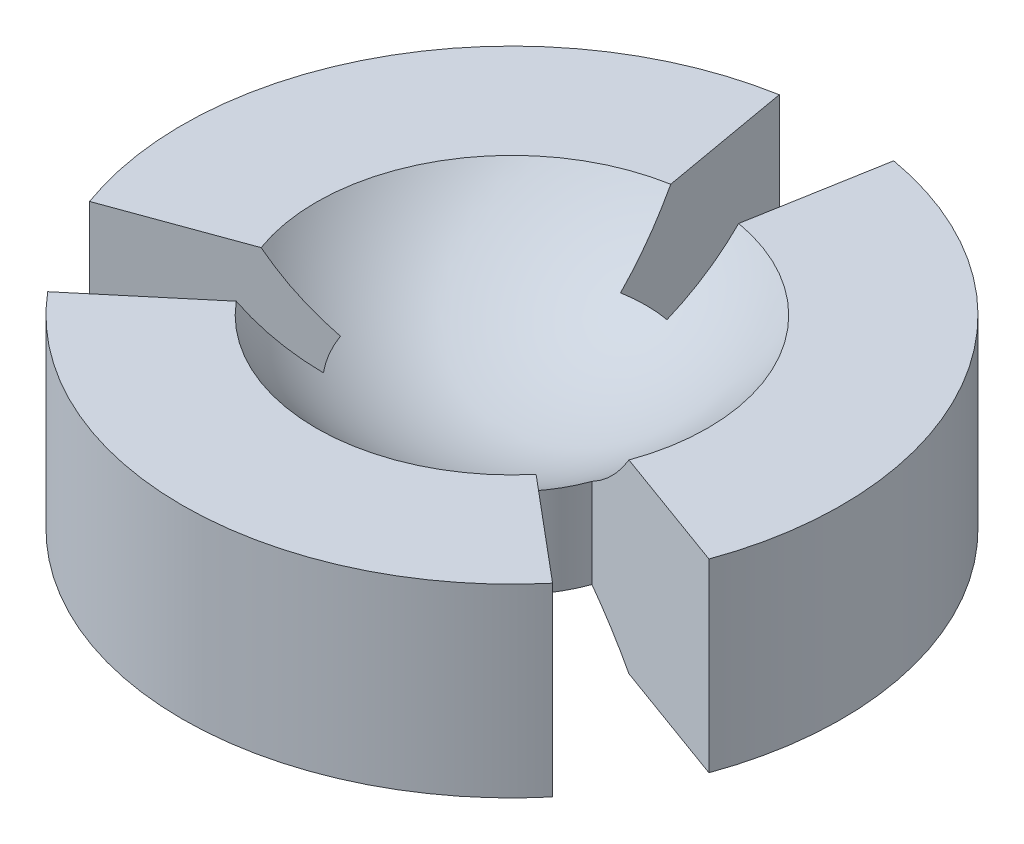
ISO-10303-21;
HEADER;
FILE_DESCRIPTION(('STEP AP214'),'2;1');
FILE_NAME('part.step','',(''),(''),'','','');
FILE_SCHEMA(('AUTOMOTIVE_DESIGN { 1 0 10303 214 1 1 1 1 }'));
ENDSEC;
DATA;
#1=APPLICATION_CONTEXT('core data for automotive mechanical design processes');
#2=APPLICATION_PROTOCOL_DEFINITION('international standard','automotive_design',2000,#1);
#3=PRODUCT_CONTEXT('',#1,'mechanical');
#4=PRODUCT('Part','Part','',(#3));
#5=PRODUCT_RELATED_PRODUCT_CATEGORY('part','',(#4));
#6=PRODUCT_DEFINITION_FORMATION('','',#4);
#7=PRODUCT_DEFINITION_CONTEXT('part definition',#1,'design');
#8=PRODUCT_DEFINITION('design','',#6,#7);
#9=PRODUCT_DEFINITION_SHAPE('','',#8);
#10=(LENGTH_UNIT() NAMED_UNIT(*) SI_UNIT(.MILLI.,.METRE.));
#11=(NAMED_UNIT(*) PLANE_ANGLE_UNIT() SI_UNIT($,.RADIAN.));
#12=(NAMED_UNIT(*) SI_UNIT($,.STERADIAN.) SOLID_ANGLE_UNIT());
#13=UNCERTAINTY_MEASURE_WITH_UNIT(LENGTH_MEASURE(1.E-05),#10,'distance_accuracy_value','');
#14=(GEOMETRIC_REPRESENTATION_CONTEXT(3) GLOBAL_UNCERTAINTY_ASSIGNED_CONTEXT((#13)) GLOBAL_UNIT_ASSIGNED_CONTEXT((#10,
#11,#12)) REPRESENTATION_CONTEXT('',''));
#15=CARTESIAN_POINT('',(0.,0.,0.));
#16=DIRECTION('',(0.,0.,1.));
#17=DIRECTION('',(1.,0.,0.));
#18=AXIS2_PLACEMENT_3D('',#15,#16,#17);
#19=CARTESIAN_POINT('',(0.,5.6,0.));
#20=DIRECTION('',(0.,1.,0.));
#21=DIRECTION('',(-1.,0.,0.));
#22=AXIS2_PLACEMENT_3D('',#19,#20,#21);
#23=PLANE('',#22);
#24=CARTESIAN_POINT('',(0.,5.6,0.));
#25=DIRECTION('',(0.,1.,0.));
#26=DIRECTION('',(-1.,0.,0.));
#27=AXIS2_PLACEMENT_3D('',#24,#25,#26);
#28=CIRCLE('',#27,4.92502957221124);
#29=CARTESIAN_POINT('',(-0.855222410170228,5.6,-4.85020730652802));
#30=VERTEX_POINT('',#29);
#31=CARTESIAN_POINT('',(-4.62801394615928,5.6,1.68445932017083));
#32=VERTEX_POINT('',#31);
#33=EDGE_CURVE('E306',#30,#32,#28,.T.);
#34=ORIENTED_EDGE('',*,*,#33,.F.);
#35=DIRECTION('',(0.173648177666931,0.,0.984807753012208));
#36=VECTOR('',#35,1.);
#37=CARTESIAN_POINT('',(-0.347296355333863,5.6,-1.96961550602442));
#38=LINE('',#37,#36);
#39=CARTESIAN_POINT('',(-0.507926054836366,5.6,-2.88059180050361));
#40=VERTEX_POINT('',#39);
#41=EDGE_CURVE('E324',#30,#40,#38,.T.);
#42=ORIENTED_EDGE('',*,*,#41,.T.);
#43=CARTESIAN_POINT('',(0.,5.6,0.));
#44=DIRECTION('',(0.,1.,0.));
#45=DIRECTION('',(-1.,0.,0.));
#46=AXIS2_PLACEMENT_3D('',#43,#44,#45);
#47=CIRCLE('',#46,2.92502957221124);
#48=CARTESIAN_POINT('',(-2.74862870458747,5.6,1.00041903351949));
#49=VERTEX_POINT('',#48);
#50=EDGE_CURVE('E207',#40,#49,#47,.T.);
#51=ORIENTED_EDGE('',*,*,#50,.T.);
#52=DIRECTION('',(-0.939692620785908,0.,0.342020143325671));
#53=VECTOR('',#52,1.);
#54=CARTESIAN_POINT('',(-1.87938524157182,5.6,0.68404028665132));
#55=LINE('',#54,#53);
#56=EDGE_CURVE('E278',#49,#32,#55,.T.);
#57=ORIENTED_EDGE('',*,*,#56,.T.);
#58=EDGE_LOOP('',(#34,#42,#51,#57));
#59=FACE_BOUND('',#58,.T.);
#60=ADVANCED_FACE('F45',(#59),#23,.F.);
#61=CARTESIAN_POINT('',(2.74862870458746,5.6,1.00041903351951));
#62=VERTEX_POINT('',#61);
#63=CARTESIAN_POINT('',(0.507926054836363,5.6,-2.88059180050361));
#64=VERTEX_POINT('',#63);
#65=EDGE_CURVE('E212',#62,#64,#47,.T.);
#66=ORIENTED_EDGE('',*,*,#65,.T.);
#67=DIRECTION('',(0.173648177666931,0.,-0.984807753012208));
#68=VECTOR('',#67,1.);
#69=CARTESIAN_POINT('',(0.34729635533386,5.6,-1.96961550602442));
#70=LINE('',#69,#68);
#71=CARTESIAN_POINT('',(0.855222410170224,5.6,-4.85020730652802));
#72=VERTEX_POINT('',#71);
#73=EDGE_CURVE('E322',#64,#72,#70,.T.);
#74=ORIENTED_EDGE('',*,*,#73,.T.);
#75=CARTESIAN_POINT('',(4.62801394615928,5.6,1.68445932017084));
#76=VERTEX_POINT('',#75);
#77=EDGE_CURVE('E307',#76,#72,#28,.T.);
#78=ORIENTED_EDGE('',*,*,#77,.F.);
#79=DIRECTION('',(-0.939692620785909,0.,-0.342020143325666));
#80=VECTOR('',#79,1.);
#81=CARTESIAN_POINT('',(1.87938524157181,5.6,0.684040286651345));
#82=LINE('',#81,#80);
#83=EDGE_CURVE('E259',#76,#62,#82,.T.);
#84=ORIENTED_EDGE('',*,*,#83,.T.);
#85=EDGE_LOOP('',(#66,#74,#78,#84));
#86=FACE_BOUND('',#85,.T.);
#87=ADVANCED_FACE('F320',(#86),#23,.F.);
#88=CARTESIAN_POINT('',(0.,8.36672218861415,0.));
#89=DIRECTION('',(0.,1.,0.));
#90=DIRECTION('',(-1.,0.,0.));
#91=AXIS2_PLACEMENT_3D('',#88,#89,#90);
#92=PLANE('',#91);
#93=DIRECTION('',(0.173648177666931,0.,0.984807753012208));
#94=VECTOR('',#93,1.);
#95=CARTESIAN_POINT('',(-0.347296355333863,8.36672218861415,-1.96961550602442));
#96=LINE('',#95,#94);
#97=CARTESIAN_POINT('',(-0.855222410170228,8.36672218861415,-4.85020730652802));
#98=VERTEX_POINT('',#97);
#99=CARTESIAN_POINT('',(-0.507926054836366,8.36672218861415,-2.88059180050361));
#100=VERTEX_POINT('',#99);
#101=EDGE_CURVE('E325',#98,#100,#96,.T.);
#102=ORIENTED_EDGE('',*,*,#101,.F.);
#103=CARTESIAN_POINT('',(0.,8.36672218861416,0.));
#104=DIRECTION('',(0.,1.,0.));
#105=DIRECTION('',(-1.,0.,0.));
#106=AXIS2_PLACEMENT_3D('',#103,#104,#105);
#107=CIRCLE('',#106,4.92502957221124);
#108=CARTESIAN_POINT('',(-4.62801394615928,8.36672218861416,1.68445932017083));
#109=VERTEX_POINT('',#108);
#110=EDGE_CURVE('E190',#98,#109,#107,.T.);
#111=ORIENTED_EDGE('',*,*,#110,.T.);
#112=DIRECTION('',(-0.939692620785908,0.,0.342020143325671));
#113=VECTOR('',#112,1.);
#114=CARTESIAN_POINT('',(-1.87938524157182,8.36672218861415,0.68404028665132));
#115=LINE('',#114,#113);
#116=CARTESIAN_POINT('',(-2.74862870458747,8.36672218861415,1.00041903351949));
#117=VERTEX_POINT('',#116);
#118=EDGE_CURVE('E173',#117,#109,#115,.T.);
#119=ORIENTED_EDGE('',*,*,#118,.F.);
#120=CARTESIAN_POINT('',(0.,8.36672218861415,0.));
#121=DIRECTION('',(0.,1.,0.));
#122=DIRECTION('',(-1.,0.,0.));
#123=AXIS2_PLACEMENT_3D('',#120,#121,#122);
#124=CIRCLE('',#123,2.92502957221124);
#125=EDGE_CURVE('E188',#100,#117,#124,.T.);
#126=ORIENTED_EDGE('',*,*,#125,.F.);
#127=EDGE_LOOP('',(#102,#111,#119,#126));
#128=FACE_BOUND('',#127,.T.);
#129=ADVANCED_FACE('F187',(#128),#92,.T.);
#130=DIRECTION('',(0.173648177666931,0.,-0.984807753012208));
#131=VECTOR('',#130,1.);
#132=CARTESIAN_POINT('',(0.34729635533386,8.36672218861415,-1.96961550602442));
#133=LINE('',#132,#131);
#134=CARTESIAN_POINT('',(0.507926054836362,8.36672218861415,-2.88059180050361));
#135=VERTEX_POINT('',#134);
#136=CARTESIAN_POINT('',(0.855222410170224,8.36672218861416,-4.85020730652802));
#137=VERTEX_POINT('',#136);
#138=EDGE_CURVE('E60',#135,#137,#133,.T.);
#139=ORIENTED_EDGE('',*,*,#138,.F.);
#140=CARTESIAN_POINT('',(2.74862870458746,8.36672218861415,1.00041903351951));
#141=VERTEX_POINT('',#140);
#142=EDGE_CURVE('E197',#141,#135,#124,.T.);
#143=ORIENTED_EDGE('',*,*,#142,.F.);
#144=DIRECTION('',(-0.939692620785909,0.,-0.342020143325666));
#145=VECTOR('',#144,1.);
#146=CARTESIAN_POINT('',(1.87938524157181,8.36672218861415,0.684040286651345));
#147=LINE('',#146,#145);
#148=CARTESIAN_POINT('',(4.62801394615928,8.36672218861415,1.68445932017084));
#149=VERTEX_POINT('',#148);
#150=EDGE_CURVE('E269',#149,#141,#147,.T.);
#151=ORIENTED_EDGE('',*,*,#150,.F.);
#152=EDGE_CURVE('E203',#149,#137,#107,.T.);
#153=ORIENTED_EDGE('',*,*,#152,.T.);
#154=EDGE_LOOP('',(#139,#143,#151,#153));
#155=FACE_BOUND('',#154,.T.);
#156=ADVANCED_FACE('F339',(#155),#92,.T.);
#157=CARTESIAN_POINT('',(0.,6.9,0.));
#158=DIRECTION('',(0.,1.,0.));
#159=DIRECTION('',(-1.,0.,0.));
#160=AXIS2_PLACEMENT_3D('',#157,#158,#159);
#161=CYLINDRICAL_SURFACE('',#160,4.92502957221124);
#162=ORIENTED_EDGE('',*,*,#110,.F.);
#163=DIRECTION('',(0.,1.,0.));
#164=VECTOR('',#163,1.);
#165=CARTESIAN_POINT('',(-0.855222410170228,6.9,-4.85020730652802));
#166=LINE('',#165,#164);
#167=EDGE_CURVE('E239',#98,#30,#166,.F.);
#168=ORIENTED_EDGE('',*,*,#167,.T.);
#169=ORIENTED_EDGE('',*,*,#33,.T.);
#170=DIRECTION('',(0.,1.,0.));
#171=VECTOR('',#170,1.);
#172=CARTESIAN_POINT('',(-4.62801394615928,6.9,1.68445932017083));
#173=LINE('',#172,#171);
#174=EDGE_CURVE('E221',#32,#109,#173,.T.);
#175=ORIENTED_EDGE('',*,*,#174,.T.);
#176=EDGE_LOOP('',(#162,#168,#169,#175));
#177=FACE_BOUND('',#176,.T.);
#178=ADVANCED_FACE('F349',(#177),#161,.T.);
#179=ORIENTED_EDGE('',*,*,#77,.T.);
#180=DIRECTION('',(0.,1.,0.));
#181=VECTOR('',#180,1.);
#182=CARTESIAN_POINT('',(0.855222410170224,6.9,-4.85020730652802));
#183=LINE('',#182,#181);
#184=EDGE_CURVE('E237',#72,#137,#183,.T.);
#185=ORIENTED_EDGE('',*,*,#184,.T.);
#186=ORIENTED_EDGE('',*,*,#152,.F.);
#187=DIRECTION('',(0.,1.,0.));
#188=VECTOR('',#187,1.);
#189=CARTESIAN_POINT('',(4.62801394615928,6.9,1.68445932017084));
#190=LINE('',#189,#188);
#191=EDGE_CURVE('E234',#149,#76,#190,.F.);
#192=ORIENTED_EDGE('',*,*,#191,.T.);
#193=EDGE_LOOP('',(#179,#185,#186,#192));
#194=FACE_BOUND('',#193,.T.);
#195=ADVANCED_FACE('F316',(#194),#161,.T.);
#196=CARTESIAN_POINT('',(-2.24070264975111,5.6,1.88017276698409));
#197=VERTEX_POINT('',#196);
#198=CARTESIAN_POINT('',(2.2407026497511,5.6,1.88017276698411));
#199=VERTEX_POINT('',#198);
#200=EDGE_CURVE('E213',#197,#199,#47,.T.);
#201=ORIENTED_EDGE('',*,*,#200,.T.);
#202=DIRECTION('',(0.766044443118979,0.,0.642787609686538));
#203=VECTOR('',#202,1.);
#204=CARTESIAN_POINT('',(1.53208888623795,5.6,1.28557521937309));
#205=LINE('',#204,#203);
#206=CARTESIAN_POINT('',(3.77279153598905,5.6,3.16574798635718));
#207=VERTEX_POINT('',#206);
#208=EDGE_CURVE('E262',#199,#207,#205,.T.);
#209=ORIENTED_EDGE('',*,*,#208,.T.);
#210=CARTESIAN_POINT('',(-3.77279153598906,5.6,3.16574798635718));
#211=VERTEX_POINT('',#210);
#212=EDGE_CURVE('E308',#211,#207,#28,.T.);
#213=ORIENTED_EDGE('',*,*,#212,.F.);
#214=DIRECTION('',(0.766044443118975,0.,-0.642787609686543));
#215=VECTOR('',#214,1.);
#216=CARTESIAN_POINT('',(-1.53208888623797,5.6,1.28557521937307));
#217=LINE('',#216,#215);
#218=EDGE_CURVE('E274',#211,#197,#217,.T.);
#219=ORIENTED_EDGE('',*,*,#218,.T.);
#220=EDGE_LOOP('',(#201,#209,#213,#219));
#221=FACE_BOUND('',#220,.T.);
#222=ADVANCED_FACE('F47',(#221),#23,.F.);
#223=CARTESIAN_POINT('',(0.,1.82210100084488,0.));
#224=DIRECTION('',(0.,1.,0.));
#225=DIRECTION('',(-1.,0.,0.));
#226=AXIS2_PLACEMENT_3D('',#223,#224,#225);
#227=SPHERICAL_SURFACE('',#226,4.77789899915513);
#228=CARTESIAN_POINT('',(0.,1.82210100084488,0.));
#229=DIRECTION('',(-0.984807753012208,0.,0.173648177666931));
#230=DIRECTION('',(0.173648177666931,0.,0.984807753012208));
#231=AXIS2_PLACEMENT_3D('',#228,#229,#230);
#232=CIRCLE('',#231,4.77789899915513);
#233=CARTESIAN_POINT('',(-0.347296355333863,6.16126207715071,-1.96961550602442));
#234=VERTEX_POINT('',#233);
#235=EDGE_CURVE('E298',#234,#40,#232,.T.);
#236=ORIENTED_EDGE('',*,*,#235,.F.);
#237=CARTESIAN_POINT('',(0.,6.16126207715071,0.));
#238=DIRECTION('',(0.,-1.,0.));
#239=DIRECTION('',(0.,0.,-1.));
#240=AXIS2_PLACEMENT_3D('',#237,#238,#239);
#241=CIRCLE('',#240,2.);
#242=CARTESIAN_POINT('',(0.34729635533386,6.16126207715071,-1.96961550602442));
#243=VERTEX_POINT('',#242);
#244=EDGE_CURVE('E304',#243,#234,#241,.F.);
#245=ORIENTED_EDGE('',*,*,#244,.F.);
#246=CARTESIAN_POINT('',(0.,1.82210100084488,0.));
#247=DIRECTION('',(0.984807753012208,0.,0.173648177666931));
#248=DIRECTION('',(0.173648177666931,0.,-0.984807753012208));
#249=AXIS2_PLACEMENT_3D('',#246,#247,#248);
#250=CIRCLE('',#249,4.77789899915513);
#251=EDGE_CURVE('E295',#64,#243,#250,.T.);
#252=ORIENTED_EDGE('',*,*,#251,.F.);
#253=ORIENTED_EDGE('',*,*,#65,.F.);
#254=CARTESIAN_POINT('',(0.,1.82210100084488,0.));
#255=DIRECTION('',(0.342020143325666,0.,-0.939692620785909));
#256=DIRECTION('',(-0.939692620785909,0.,-0.342020143325666));
#257=AXIS2_PLACEMENT_3D('',#254,#255,#256);
#258=CIRCLE('',#257,4.77789899915513);
#259=CARTESIAN_POINT('',(1.87938524157181,6.16126207715071,0.684040286651344));
#260=VERTEX_POINT('',#259);
#261=EDGE_CURVE('E290',#260,#62,#258,.T.);
#262=ORIENTED_EDGE('',*,*,#261,.F.);
#263=CARTESIAN_POINT('',(0.,6.16126207715071,0.));
#264=DIRECTION('',(0.,-1.,0.));
#265=DIRECTION('',(0.,0.,-1.));
#266=AXIS2_PLACEMENT_3D('',#263,#264,#265);
#267=CIRCLE('',#266,2.);
#268=CARTESIAN_POINT('',(1.53208888623795,6.16126207715071,1.28557521937309));
#269=VERTEX_POINT('',#268);
#270=EDGE_CURVE('E302',#269,#260,#267,.F.);
#271=ORIENTED_EDGE('',*,*,#270,.F.);
#272=CARTESIAN_POINT('',(0.,1.82210100084488,0.));
#273=DIRECTION('',(-0.642787609686538,0.,0.766044443118979));
#274=DIRECTION('',(0.766044443118979,0.,0.642787609686538));
#275=AXIS2_PLACEMENT_3D('',#272,#273,#274);
#276=CIRCLE('',#275,4.77789899915513);
#277=EDGE_CURVE('E258',#199,#269,#276,.T.);
#278=ORIENTED_EDGE('',*,*,#277,.F.);
#279=ORIENTED_EDGE('',*,*,#200,.F.);
#280=CARTESIAN_POINT('',(0.,1.82210100084488,0.));
#281=DIRECTION('',(0.642787609686543,0.,0.766044443118975));
#282=DIRECTION('',(0.766044443118975,0.,-0.642787609686543));
#283=AXIS2_PLACEMENT_3D('',#280,#281,#282);
#284=CIRCLE('',#283,4.77789899915513);
#285=CARTESIAN_POINT('',(-1.53208888623797,6.16126207715071,1.28557521937307));
#286=VERTEX_POINT('',#285);
#287=EDGE_CURVE('E285',#286,#197,#284,.T.);
#288=ORIENTED_EDGE('',*,*,#287,.F.);
#289=CARTESIAN_POINT('',(0.,6.16126207715071,0.));
#290=DIRECTION('',(0.,-1.,0.));
#291=DIRECTION('',(0.,0.,-1.));
#292=AXIS2_PLACEMENT_3D('',#289,#290,#291);
#293=CIRCLE('',#292,2.);
#294=CARTESIAN_POINT('',(-1.87938524157182,6.16126207715071,0.684040286651319));
#295=VERTEX_POINT('',#294);
#296=EDGE_CURVE('E300',#295,#286,#293,.F.);
#297=ORIENTED_EDGE('',*,*,#296,.F.);
#298=CARTESIAN_POINT('',(0.,1.82210100084488,0.));
#299=DIRECTION('',(-0.342020143325671,0.,-0.939692620785907));
#300=DIRECTION('',(-0.939692620785908,0.,0.342020143325671));
#301=AXIS2_PLACEMENT_3D('',#298,#299,#300);
#302=CIRCLE('',#301,4.77789899915513);
#303=EDGE_CURVE('E180',#49,#295,#302,.T.);
#304=ORIENTED_EDGE('',*,*,#303,.F.);
#305=ORIENTED_EDGE('',*,*,#50,.F.);
#306=EDGE_LOOP('',(#236,#245,#252,#253,#262,#271,#278,#279,#288,#297,#304,#305));
#307=FACE_BOUND('',#306,.T.);
#308=ADVANCED_FACE('F345',(#307),#227,.F.);
#309=CARTESIAN_POINT('',(0.,10.55,0.));
#310=DIRECTION('',(0.,1.,0.));
#311=DIRECTION('',(-1.,0.,0.));
#312=AXIS2_PLACEMENT_3D('',#309,#310,#311);
#313=SPHERICAL_SURFACE('',#312,3.65);
#314=CARTESIAN_POINT('',(0.,7.49672307184559,0.));
#315=DIRECTION('',(0.,1.,0.));
#316=DIRECTION('',(0.,0.,1.));
#317=AXIS2_PLACEMENT_3D('',#314,#315,#316);
#318=CIRCLE('',#317,2.);
#319=CARTESIAN_POINT('',(0.34729635533386,7.49672307184559,-1.96961550602442));
#320=VERTEX_POINT('',#319);
#321=CARTESIAN_POINT('',(-0.347296355333863,7.49672307184559,-1.96961550602442));
#322=VERTEX_POINT('',#321);
#323=EDGE_CURVE('E11',#320,#322,#318,.T.);
#324=ORIENTED_EDGE('',*,*,#323,.T.);
#325=CARTESIAN_POINT('',(0.,10.55,0.));
#326=DIRECTION('',(-0.984807753012208,0.,0.173648177666931));
#327=DIRECTION('',(0.173648177666931,0.,0.984807753012208));
#328=AXIS2_PLACEMENT_3D('',#325,#326,#327);
#329=CIRCLE('',#328,3.65);
#330=EDGE_CURVE('E196',#322,#100,#329,.F.);
#331=ORIENTED_EDGE('',*,*,#330,.T.);
#332=ORIENTED_EDGE('',*,*,#125,.T.);
#333=CARTESIAN_POINT('',(0.,10.55,0.));
#334=DIRECTION('',(-0.342020143325671,0.,-0.939692620785907));
#335=DIRECTION('',(-0.939692620785908,0.,0.342020143325671));
#336=AXIS2_PLACEMENT_3D('',#333,#334,#335);
#337=CIRCLE('',#336,3.65);
#338=CARTESIAN_POINT('',(-1.87938524157182,7.49672307184559,0.684040286651319));
#339=VERTEX_POINT('',#338);
#340=EDGE_CURVE('E170',#117,#339,#337,.F.);
#341=ORIENTED_EDGE('',*,*,#340,.T.);
#342=CARTESIAN_POINT('',(0.,7.49672307184559,0.));
#343=DIRECTION('',(0.,1.,0.));
#344=DIRECTION('',(0.,0.,1.));
#345=AXIS2_PLACEMENT_3D('',#342,#343,#344);
#346=CIRCLE('',#345,2.);
#347=CARTESIAN_POINT('',(-1.53208888623797,7.49672307184559,1.28557521937307));
#348=VERTEX_POINT('',#347);
#349=EDGE_CURVE('E242',#339,#348,#346,.T.);
#350=ORIENTED_EDGE('',*,*,#349,.T.);
#351=CARTESIAN_POINT('',(0.,10.55,0.));
#352=DIRECTION('',(0.642787609686543,0.,0.766044443118975));
#353=DIRECTION('',(0.766044443118975,0.,-0.642787609686543));
#354=AXIS2_PLACEMENT_3D('',#351,#352,#353);
#355=CIRCLE('',#354,3.65);
#356=CARTESIAN_POINT('',(-2.24070264975111,8.36672218861415,1.88017276698409));
#357=VERTEX_POINT('',#356);
#358=EDGE_CURVE('E283',#348,#357,#355,.F.);
#359=ORIENTED_EDGE('',*,*,#358,.T.);
#360=CARTESIAN_POINT('',(2.24070264975109,8.36672218861415,1.88017276698411));
#361=VERTEX_POINT('',#360);
#362=EDGE_CURVE('E200',#357,#361,#124,.T.);
#363=ORIENTED_EDGE('',*,*,#362,.T.);
#364=CARTESIAN_POINT('',(0.,10.55,0.));
#365=DIRECTION('',(-0.642787609686538,0.,0.766044443118979));
#366=DIRECTION('',(0.766044443118979,0.,0.642787609686538));
#367=AXIS2_PLACEMENT_3D('',#364,#365,#366);
#368=CIRCLE('',#367,3.65);
#369=CARTESIAN_POINT('',(1.53208888623795,7.49672307184559,1.28557521937309));
#370=VERTEX_POINT('',#369);
#371=EDGE_CURVE('E247',#361,#370,#368,.F.);
#372=ORIENTED_EDGE('',*,*,#371,.T.);
#373=CARTESIAN_POINT('',(0.,7.49672307184559,0.));
#374=DIRECTION('',(0.,1.,0.));
#375=DIRECTION('',(0.,0.,1.));
#376=AXIS2_PLACEMENT_3D('',#373,#374,#375);
#377=CIRCLE('',#376,2.);
#378=CARTESIAN_POINT('',(1.87938524157181,7.49672307184559,0.684040286651344));
#379=VERTEX_POINT('',#378);
#380=EDGE_CURVE('E53',#370,#379,#377,.T.);
#381=ORIENTED_EDGE('',*,*,#380,.T.);
#382=CARTESIAN_POINT('',(0.,10.55,0.));
#383=DIRECTION('',(0.342020143325666,0.,-0.939692620785909));
#384=DIRECTION('',(-0.939692620785909,0.,-0.342020143325666));
#385=AXIS2_PLACEMENT_3D('',#382,#383,#384);
#386=CIRCLE('',#385,3.65);
#387=EDGE_CURVE('E245',#379,#141,#386,.F.);
#388=ORIENTED_EDGE('',*,*,#387,.T.);
#389=ORIENTED_EDGE('',*,*,#142,.T.);
#390=CARTESIAN_POINT('',(0.,10.55,0.));
#391=DIRECTION('',(0.984807753012208,0.,0.173648177666931));
#392=DIRECTION('',(0.173648177666931,0.,-0.984807753012208));
#393=AXIS2_PLACEMENT_3D('',#390,#391,#392);
#394=CIRCLE('',#393,3.65);
#395=EDGE_CURVE('E292',#135,#320,#394,.F.);
#396=ORIENTED_EDGE('',*,*,#395,.T.);
#397=EDGE_LOOP('',(#324,#331,#332,#341,#350,#359,#363,#372,#381,#388,#389,#396));
#398=FACE_BOUND('',#397,.T.);
#399=ADVANCED_FACE('F195',(#398),#313,.F.);
#400=DIRECTION('',(0.766044443118979,0.,0.642787609686538));
#401=VECTOR('',#400,1.);
#402=CARTESIAN_POINT('',(1.53208888623795,8.36672218861415,1.28557521937309));
#403=LINE('',#402,#401);
#404=CARTESIAN_POINT('',(3.77279153598905,8.36672218861416,3.16574798635718));
#405=VERTEX_POINT('',#404);
#406=EDGE_CURVE('E68',#361,#405,#403,.T.);
#407=ORIENTED_EDGE('',*,*,#406,.F.);
#408=ORIENTED_EDGE('',*,*,#362,.F.);
#409=DIRECTION('',(0.766044443118975,0.,-0.642787609686543));
#410=VECTOR('',#409,1.);
#411=CARTESIAN_POINT('',(-1.53208888623797,8.36672218861415,1.28557521937307));
#412=LINE('',#411,#410);
#413=CARTESIAN_POINT('',(-3.77279153598906,8.36672218861415,3.16574798635718));
#414=VERTEX_POINT('',#413);
#415=EDGE_CURVE('E192',#414,#357,#412,.T.);
#416=ORIENTED_EDGE('',*,*,#415,.F.);
#417=EDGE_CURVE('E198',#414,#405,#107,.T.);
#418=ORIENTED_EDGE('',*,*,#417,.T.);
#419=EDGE_LOOP('',(#407,#408,#416,#418));
#420=FACE_BOUND('',#419,.T.);
#421=ADVANCED_FACE('F361',(#420),#92,.T.);
#422=ORIENTED_EDGE('',*,*,#212,.T.);
#423=DIRECTION('',(0.,1.,0.));
#424=VECTOR('',#423,1.);
#425=CARTESIAN_POINT('',(3.77279153598905,6.9,3.16574798635718));
#426=LINE('',#425,#424);
#427=EDGE_CURVE('E230',#207,#405,#426,.T.);
#428=ORIENTED_EDGE('',*,*,#427,.T.);
#429=ORIENTED_EDGE('',*,*,#417,.F.);
#430=DIRECTION('',(0.,1.,0.));
#431=VECTOR('',#430,1.);
#432=CARTESIAN_POINT('',(-3.77279153598906,6.9,3.16574798635718));
#433=LINE('',#432,#431);
#434=EDGE_CURVE('E226',#414,#211,#433,.F.);
#435=ORIENTED_EDGE('',*,*,#434,.T.);
#436=EDGE_LOOP('',(#422,#428,#429,#435));
#437=FACE_BOUND('',#436,.T.);
#438=ADVANCED_FACE('F363',(#437),#161,.T.);
#439=CARTESIAN_POINT('',(0.,5.6,0.));
#440=DIRECTION('',(0.,1.,0.));
#441=DIRECTION('',(0.,0.,1.));
#442=AXIS2_PLACEMENT_3D('',#439,#440,#441);
#443=CYLINDRICAL_SURFACE('',#442,2.);
#444=ORIENTED_EDGE('',*,*,#296,.T.);
#445=DIRECTION('',(0.,1.,0.));
#446=VECTOR('',#445,1.);
#447=CARTESIAN_POINT('',(-1.53208888623797,5.6,1.28557521937307));
#448=LINE('',#447,#446);
#449=EDGE_CURVE('E275',#286,#348,#448,.T.);
#450=ORIENTED_EDGE('',*,*,#449,.T.);
#451=ORIENTED_EDGE('',*,*,#349,.F.);
#452=DIRECTION('',(0.,1.,0.));
#453=VECTOR('',#452,1.);
#454=CARTESIAN_POINT('',(-1.87938524157182,5.6,0.68404028665132));
#455=LINE('',#454,#453);
#456=EDGE_CURVE('E176',#295,#339,#455,.T.);
#457=ORIENTED_EDGE('',*,*,#456,.F.);
#458=EDGE_LOOP('',(#444,#450,#451,#457));
#459=FACE_BOUND('',#458,.T.);
#460=ADVANCED_FACE('F356',(#459),#443,.T.);
#461=CARTESIAN_POINT('',(-1.53208888623797,5.6,1.28557521937307));
#462=DIRECTION('',(0.642787609686543,0.,0.766044443118975));
#463=DIRECTION('',(0.766044443118975,0.,-0.642787609686543));
#464=AXIS2_PLACEMENT_3D('',#461,#462,#463);
#465=PLANE('',#464);
#466=ORIENTED_EDGE('',*,*,#287,.T.);
#467=ORIENTED_EDGE('',*,*,#218,.F.);
#468=ORIENTED_EDGE('',*,*,#434,.F.);
#469=ORIENTED_EDGE('',*,*,#415,.T.);
#470=ORIENTED_EDGE('',*,*,#358,.F.);
#471=ORIENTED_EDGE('',*,*,#449,.F.);
#472=EDGE_LOOP('',(#466,#467,#468,#469,#470,#471));
#473=FACE_BOUND('',#472,.T.);
#474=ADVANCED_FACE('F358',(#473),#465,.F.);
#475=CARTESIAN_POINT('',(-1.87938524157182,5.6,0.68404028665132));
#476=DIRECTION('',(-0.342020143325671,0.,-0.939692620785907));
#477=DIRECTION('',(-0.939692620785908,0.,0.342020143325671));
#478=AXIS2_PLACEMENT_3D('',#475,#476,#477);
#479=PLANE('',#478);
#480=ORIENTED_EDGE('',*,*,#303,.T.);
#481=ORIENTED_EDGE('',*,*,#456,.T.);
#482=ORIENTED_EDGE('',*,*,#340,.F.);
#483=ORIENTED_EDGE('',*,*,#118,.T.);
#484=ORIENTED_EDGE('',*,*,#174,.F.);
#485=ORIENTED_EDGE('',*,*,#56,.F.);
#486=EDGE_LOOP('',(#480,#481,#482,#483,#484,#485));
#487=FACE_BOUND('',#486,.T.);
#488=ADVANCED_FACE('F172',(#487),#479,.F.);
#489=CARTESIAN_POINT('',(0.,5.6,0.));
#490=DIRECTION('',(0.,1.,0.));
#491=DIRECTION('',(0.,0.,1.));
#492=AXIS2_PLACEMENT_3D('',#489,#490,#491);
#493=CYLINDRICAL_SURFACE('',#492,2.);
#494=ORIENTED_EDGE('',*,*,#270,.T.);
#495=DIRECTION('',(0.,1.,0.));
#496=VECTOR('',#495,1.);
#497=CARTESIAN_POINT('',(1.87938524157181,5.6,0.684040286651345));
#498=LINE('',#497,#496);
#499=EDGE_CURVE('E191',#260,#379,#498,.T.);
#500=ORIENTED_EDGE('',*,*,#499,.T.);
#501=ORIENTED_EDGE('',*,*,#380,.F.);
#502=DIRECTION('',(0.,1.,0.));
#503=VECTOR('',#502,1.);
#504=CARTESIAN_POINT('',(1.53208888623795,5.6,1.28557521937309));
#505=LINE('',#504,#503);
#506=EDGE_CURVE('E253',#269,#370,#505,.T.);
#507=ORIENTED_EDGE('',*,*,#506,.F.);
#508=EDGE_LOOP('',(#494,#500,#501,#507));
#509=FACE_BOUND('',#508,.T.);
#510=ADVANCED_FACE('F252',(#509),#493,.T.);
#511=CARTESIAN_POINT('',(1.87938524157181,5.6,0.684040286651345));
#512=DIRECTION('',(0.342020143325666,0.,-0.939692620785909));
#513=DIRECTION('',(-0.939692620785909,0.,-0.342020143325666));
#514=AXIS2_PLACEMENT_3D('',#511,#512,#513);
#515=PLANE('',#514);
#516=ORIENTED_EDGE('',*,*,#261,.T.);
#517=ORIENTED_EDGE('',*,*,#83,.F.);
#518=ORIENTED_EDGE('',*,*,#191,.F.);
#519=ORIENTED_EDGE('',*,*,#150,.T.);
#520=ORIENTED_EDGE('',*,*,#387,.F.);
#521=ORIENTED_EDGE('',*,*,#499,.F.);
#522=EDGE_LOOP('',(#516,#517,#518,#519,#520,#521));
#523=FACE_BOUND('',#522,.T.);
#524=ADVANCED_FACE('F341',(#523),#515,.F.);
#525=CARTESIAN_POINT('',(1.53208888623795,5.6,1.28557521937309));
#526=DIRECTION('',(-0.642787609686538,0.,0.766044443118979));
#527=DIRECTION('',(0.766044443118979,0.,0.642787609686538));
#528=AXIS2_PLACEMENT_3D('',#525,#526,#527);
#529=PLANE('',#528);
#530=ORIENTED_EDGE('',*,*,#277,.T.);
#531=ORIENTED_EDGE('',*,*,#506,.T.);
#532=ORIENTED_EDGE('',*,*,#371,.F.);
#533=ORIENTED_EDGE('',*,*,#406,.T.);
#534=ORIENTED_EDGE('',*,*,#427,.F.);
#535=ORIENTED_EDGE('',*,*,#208,.F.);
#536=EDGE_LOOP('',(#530,#531,#532,#533,#534,#535));
#537=FACE_BOUND('',#536,.T.);
#538=ADVANCED_FACE('F256',(#537),#529,.F.);
#539=CARTESIAN_POINT('',(0.,5.6,0.));
#540=DIRECTION('',(0.,1.,0.));
#541=DIRECTION('',(0.,0.,1.));
#542=AXIS2_PLACEMENT_3D('',#539,#540,#541);
#543=CYLINDRICAL_SURFACE('',#542,2.);
#544=ORIENTED_EDGE('',*,*,#244,.T.);
#545=DIRECTION('',(0.,1.,0.));
#546=VECTOR('',#545,1.);
#547=CARTESIAN_POINT('',(-0.347296355333863,5.6,-1.96961550602442));
#548=LINE('',#547,#546);
#549=EDGE_CURVE('E181',#234,#322,#548,.T.);
#550=ORIENTED_EDGE('',*,*,#549,.T.);
#551=ORIENTED_EDGE('',*,*,#323,.F.);
#552=DIRECTION('',(0.,1.,0.));
#553=VECTOR('',#552,1.);
#554=CARTESIAN_POINT('',(0.34729635533386,5.6,-1.96961550602442));
#555=LINE('',#554,#553);
#556=EDGE_CURVE('E266',#243,#320,#555,.T.);
#557=ORIENTED_EDGE('',*,*,#556,.F.);
#558=EDGE_LOOP('',(#544,#550,#551,#557));
#559=FACE_BOUND('',#558,.T.);
#560=ADVANCED_FACE('F346',(#559),#543,.T.);
#561=CARTESIAN_POINT('',(-0.347296355333863,5.6,-1.96961550602442));
#562=DIRECTION('',(-0.984807753012208,0.,0.173648177666931));
#563=DIRECTION('',(0.173648177666931,0.,0.984807753012208));
#564=AXIS2_PLACEMENT_3D('',#561,#562,#563);
#565=PLANE('',#564);
#566=ORIENTED_EDGE('',*,*,#235,.T.);
#567=ORIENTED_EDGE('',*,*,#41,.F.);
#568=ORIENTED_EDGE('',*,*,#167,.F.);
#569=ORIENTED_EDGE('',*,*,#101,.T.);
#570=ORIENTED_EDGE('',*,*,#330,.F.);
#571=ORIENTED_EDGE('',*,*,#549,.F.);
#572=EDGE_LOOP('',(#566,#567,#568,#569,#570,#571));
#573=FACE_BOUND('',#572,.T.);
#574=ADVANCED_FACE('F348',(#573),#565,.F.);
#575=CARTESIAN_POINT('',(0.34729635533386,5.6,-1.96961550602442));
#576=DIRECTION('',(0.984807753012208,0.,0.173648177666931));
#577=DIRECTION('',(0.173648177666931,0.,-0.984807753012208));
#578=AXIS2_PLACEMENT_3D('',#575,#576,#577);
#579=PLANE('',#578);
#580=ORIENTED_EDGE('',*,*,#251,.T.);
#581=ORIENTED_EDGE('',*,*,#556,.T.);
#582=ORIENTED_EDGE('',*,*,#395,.F.);
#583=ORIENTED_EDGE('',*,*,#138,.T.);
#584=ORIENTED_EDGE('',*,*,#184,.F.);
#585=ORIENTED_EDGE('',*,*,#73,.F.);
#586=EDGE_LOOP('',(#580,#581,#582,#583,#584,#585));
#587=FACE_BOUND('',#586,.T.);
#588=ADVANCED_FACE('F335',(#587),#579,.F.);
#589=CLOSED_SHELL('',(#60,#87,#129,#156,#178,#195,#222,#308,#399,#421,#438,#460,#474,#488,#510,
#524,#538,#560,#574,#588));
#590=MANIFOLD_SOLID_BREP('B2',#589);
#591=ADVANCED_BREP_SHAPE_REPRESENTATION('',(#18,#590),#14);
#592=SHAPE_DEFINITION_REPRESENTATION(#9,#591);
ENDSEC;
END-ISO-10303-21;
